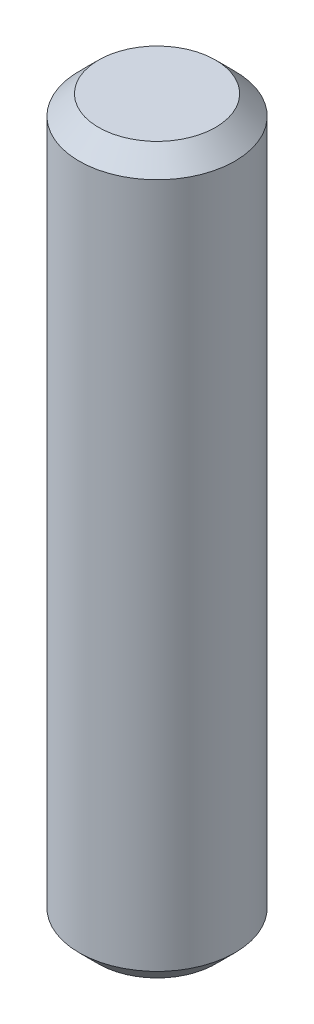
ISO-10303-21;
HEADER;
FILE_DESCRIPTION(('STEP AP214'),'2;1');
FILE_NAME('part.step','',(''),(''),'','','');
FILE_SCHEMA(('AUTOMOTIVE_DESIGN { 1 0 10303 214 1 1 1 1 }'));
ENDSEC;
DATA;
#1=APPLICATION_CONTEXT('core data for automotive mechanical design processes');
#2=APPLICATION_PROTOCOL_DEFINITION('international standard','automotive_design',2000,#1);
#3=PRODUCT_CONTEXT('',#1,'mechanical');
#4=PRODUCT('Part','Part','',(#3));
#5=PRODUCT_RELATED_PRODUCT_CATEGORY('part','',(#4));
#6=PRODUCT_DEFINITION_FORMATION('','',#4);
#7=PRODUCT_DEFINITION_CONTEXT('part definition',#1,'design');
#8=PRODUCT_DEFINITION('design','',#6,#7);
#9=PRODUCT_DEFINITION_SHAPE('','',#8);
#10=(LENGTH_UNIT() NAMED_UNIT(*) SI_UNIT(.MILLI.,.METRE.));
#11=(NAMED_UNIT(*) PLANE_ANGLE_UNIT() SI_UNIT($,.RADIAN.));
#12=(NAMED_UNIT(*) SI_UNIT($,.STERADIAN.) SOLID_ANGLE_UNIT());
#13=UNCERTAINTY_MEASURE_WITH_UNIT(LENGTH_MEASURE(1.E-05),#10,'distance_accuracy_value','');
#14=(GEOMETRIC_REPRESENTATION_CONTEXT(3) GLOBAL_UNCERTAINTY_ASSIGNED_CONTEXT((#13)) GLOBAL_UNIT_ASSIGNED_CONTEXT((#10,
#11,#12)) REPRESENTATION_CONTEXT('',''));
#15=CARTESIAN_POINT('',(0.,0.,0.));
#16=DIRECTION('',(0.,0.,1.));
#17=DIRECTION('',(1.,0.,0.));
#18=AXIS2_PLACEMENT_3D('',#15,#16,#17);
#19=CARTESIAN_POINT('',(0.999911309983845,18.5999999999999,0.));
#20=DIRECTION('',(0.,1.,0.));
#21=DIRECTION('',(-1.,0.,0.));
#22=AXIS2_PLACEMENT_3D('',#19,#20,#21);
#23=PLANE('',#22);
#24=CARTESIAN_POINT('',(0.,18.600000000049,0.));
#25=DIRECTION('',(0.,-1.,0.));
#26=DIRECTION('',(1.,0.,0.));
#27=AXIS2_PLACEMENT_3D('',#24,#25,#26);
#28=CIRCLE('',#27,1.50000000002144);
#29=CARTESIAN_POINT('',(1.50000000002138,18.600000000049,0.));
#30=VERTEX_POINT('',#29);
#31=EDGE_CURVE('E17',#30,#30,#28,.T.);
#32=ORIENTED_EDGE('',*,*,#31,.F.);
#33=EDGE_LOOP('',(#32));
#34=FACE_BOUND('',#33,.T.);
#35=ADVANCED_FACE('F14',(#34),#23,.T.);
#36=CARTESIAN_POINT('',(0.999911309983844,0.,0.));
#37=DIRECTION('',(0.,-1.,0.));
#38=DIRECTION('',(1.,0.,0.));
#39=AXIS2_PLACEMENT_3D('',#36,#37,#38);
#40=PLANE('',#39);
#41=CARTESIAN_POINT('',(0.,0.,0.));
#42=DIRECTION('',(0.,1.,0.));
#43=DIRECTION('',(-1.,0.,0.));
#44=AXIS2_PLACEMENT_3D('',#41,#42,#43);
#45=CIRCLE('',#44,1.50000000002138);
#46=CARTESIAN_POINT('',(-1.50000000002138,0.,0.));
#47=VERTEX_POINT('',#46);
#48=EDGE_CURVE('E26',#47,#47,#45,.T.);
#49=ORIENTED_EDGE('',*,*,#48,.F.);
#50=EDGE_LOOP('',(#49));
#51=FACE_BOUND('',#50,.T.);
#52=ADVANCED_FACE('F37',(#51),#40,.T.);
#53=CARTESIAN_POINT('',(0.,18.1000000000608,0.));
#54=DIRECTION('',(0.,-1.,0.));
#55=DIRECTION('',(1.,0.,0.));
#56=AXIS2_PLACEMENT_3D('',#53,#54,#55);
#57=CONICAL_SURFACE('',#56,2.00000000000961,0.785398163397447);
#58=CARTESIAN_POINT('',(0.,18.1,0.));
#59=DIRECTION('',(0.,-1.,0.));
#60=DIRECTION('',(1.,0.,0.));
#61=AXIS2_PLACEMENT_3D('',#58,#59,#60);
#62=CIRCLE('',#61,2.00000000000004);
#63=CARTESIAN_POINT('',(1.99999999999998,18.1,0.));
#64=VERTEX_POINT('',#63);
#65=EDGE_CURVE('E21',#64,#64,#62,.T.);
#66=ORIENTED_EDGE('',*,*,#65,.F.);
#67=EDGE_LOOP('',(#66));
#68=FACE_BOUND('',#67,.T.);
#69=ORIENTED_EDGE('',*,*,#31,.T.);
#70=EDGE_LOOP('',(#69));
#71=FACE_BOUND('',#70,.T.);
#72=ADVANCED_FACE('F34',(#68,#71),#57,.T.);
#73=CARTESIAN_POINT('',(0.,0.49999999993134,0.));
#74=DIRECTION('',(0.,1.,0.));
#75=DIRECTION('',(-1.,0.,0.));
#76=AXIS2_PLACEMENT_3D('',#73,#74,#75);
#77=CONICAL_SURFACE('',#76,1.9999999999527,0.785398163397445);
#78=CARTESIAN_POINT('',(0.,0.499999999999945,0.));
#79=DIRECTION('',(0.,-1.,0.));
#80=DIRECTION('',(1.,0.,0.));
#81=AXIS2_PLACEMENT_3D('',#78,#79,#80);
#82=CIRCLE('',#81,2.00000000000004);
#83=CARTESIAN_POINT('',(2.00000000000004,0.499999999999952,0.));
#84=VERTEX_POINT('',#83);
#85=EDGE_CURVE('E10',#84,#84,#82,.F.);
#86=ORIENTED_EDGE('',*,*,#85,.F.);
#87=EDGE_LOOP('',(#86));
#88=FACE_BOUND('',#87,.T.);
#89=ORIENTED_EDGE('',*,*,#48,.T.);
#90=EDGE_LOOP('',(#89));
#91=FACE_BOUND('',#90,.T.);
#92=ADVANCED_FACE('F45',(#88,#91),#77,.T.);
#93=CARTESIAN_POINT('',(3.49243203801031E-12,-999.999999999998,0.));
#94=DIRECTION('',(0.,-1.,0.));
#95=DIRECTION('',(1.,0.,0.));
#96=AXIS2_PLACEMENT_3D('',#93,#94,#95);
#97=CYLINDRICAL_SURFACE('',#96,2.00000000000004);
#98=ORIENTED_EDGE('',*,*,#85,.T.);
#99=EDGE_LOOP('',(#98));
#100=FACE_BOUND('',#99,.T.);
#101=ORIENTED_EDGE('',*,*,#65,.T.);
#102=EDGE_LOOP('',(#101));
#103=FACE_BOUND('',#102,.T.);
#104=ADVANCED_FACE('F43',(#100,#103),#97,.T.);
#105=CLOSED_SHELL('',(#35,#52,#72,#92,#104));
#106=MANIFOLD_SOLID_BREP('B1',#105);
#107=ADVANCED_BREP_SHAPE_REPRESENTATION('',(#18,#106),#14);
#108=SHAPE_DEFINITION_REPRESENTATION(#9,#107);
ENDSEC;
END-ISO-10303-21;
